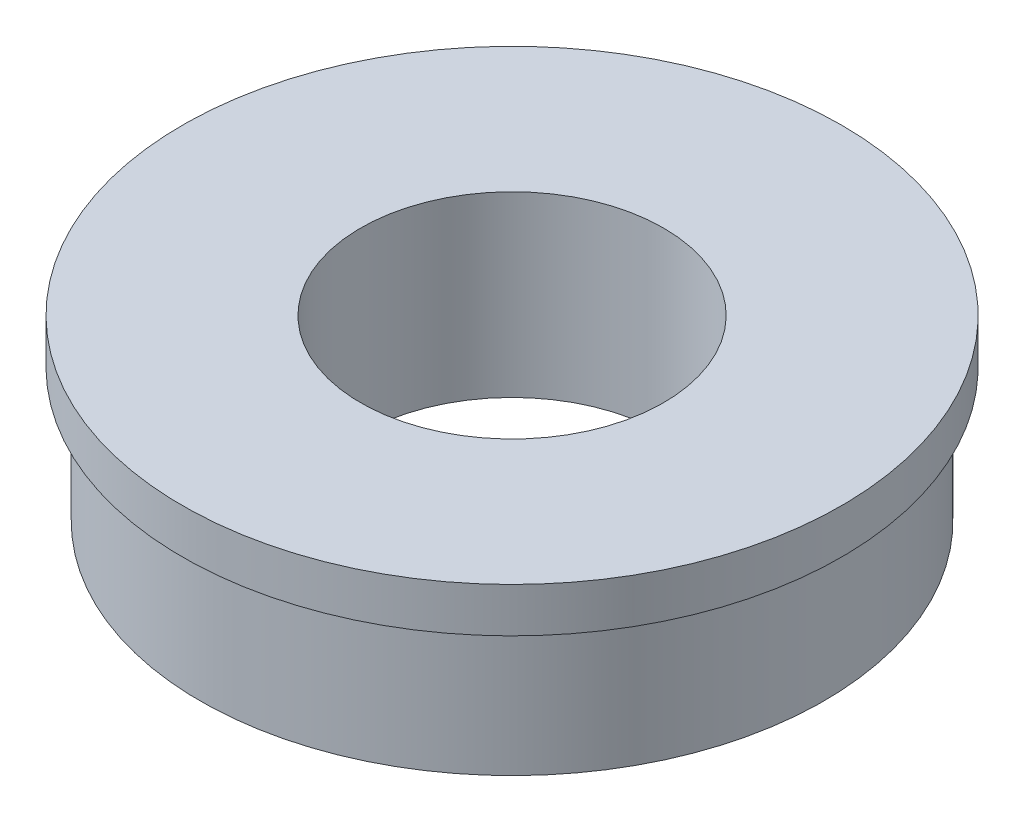
ISO-10303-21;
HEADER;
FILE_DESCRIPTION(('STEP AP214'),'2;1');
FILE_NAME('part.step','',(''),(''),'','','');
FILE_SCHEMA(('AUTOMOTIVE_DESIGN { 1 0 10303 214 1 1 1 1 }'));
ENDSEC;
DATA;
#1=APPLICATION_CONTEXT('core data for automotive mechanical design processes');
#2=APPLICATION_PROTOCOL_DEFINITION('international standard','automotive_design',2000,#1);
#3=PRODUCT_CONTEXT('',#1,'mechanical');
#4=PRODUCT('Part','Part','',(#3));
#5=PRODUCT_RELATED_PRODUCT_CATEGORY('part','',(#4));
#6=PRODUCT_DEFINITION_FORMATION('','',#4);
#7=PRODUCT_DEFINITION_CONTEXT('part definition',#1,'design');
#8=PRODUCT_DEFINITION('design','',#6,#7);
#9=PRODUCT_DEFINITION_SHAPE('','',#8);
#10=(LENGTH_UNIT() NAMED_UNIT(*) SI_UNIT(.MILLI.,.METRE.));
#11=(NAMED_UNIT(*) PLANE_ANGLE_UNIT() SI_UNIT($,.RADIAN.));
#12=(NAMED_UNIT(*) SI_UNIT($,.STERADIAN.) SOLID_ANGLE_UNIT());
#13=UNCERTAINTY_MEASURE_WITH_UNIT(LENGTH_MEASURE(1.E-05),#10,'distance_accuracy_value','');
#14=(GEOMETRIC_REPRESENTATION_CONTEXT(3) GLOBAL_UNCERTAINTY_ASSIGNED_CONTEXT((#13)) GLOBAL_UNIT_ASSIGNED_CONTEXT((#10,
#11,#12)) REPRESENTATION_CONTEXT('',''));
#15=CARTESIAN_POINT('',(0.,0.,0.));
#16=DIRECTION('',(0.,0.,1.));
#17=DIRECTION('',(1.,0.,0.));
#18=AXIS2_PLACEMENT_3D('',#15,#16,#17);
#19=CARTESIAN_POINT('',(0.,-7.37837869532181,0.));
#20=DIRECTION('',(0.,-1.,0.));
#21=DIRECTION('',(0.,0.,-1.));
#22=AXIS2_PLACEMENT_3D('',#19,#20,#21);
#23=CYLINDRICAL_SURFACE('',#22,8.5);
#24=CARTESIAN_POINT('',(0.,-10.,0.));
#25=DIRECTION('',(0.,-1.,0.));
#26=DIRECTION('',(0.,0.,-1.));
#27=AXIS2_PLACEMENT_3D('',#24,#25,#26);
#28=CIRCLE('',#27,8.5);
#29=CARTESIAN_POINT('',(0.,-10.,-8.5));
#30=VERTEX_POINT('',#29);
#31=EDGE_CURVE('E57',#30,#30,#28,.T.);
#32=ORIENTED_EDGE('',*,*,#31,.T.);
#33=EDGE_LOOP('',(#32));
#34=FACE_BOUND('',#33,.T.);
#35=CARTESIAN_POINT('',(0.,0.,0.));
#36=DIRECTION('',(0.,-1.,0.));
#37=DIRECTION('',(0.,0.,-1.));
#38=AXIS2_PLACEMENT_3D('',#35,#36,#37);
#39=CIRCLE('',#38,8.5);
#40=CARTESIAN_POINT('',(0.,0.,-8.5));
#41=VERTEX_POINT('',#40);
#42=EDGE_CURVE('E10',#41,#41,#39,.T.);
#43=ORIENTED_EDGE('',*,*,#42,.F.);
#44=EDGE_LOOP('',(#43));
#45=FACE_BOUND('',#44,.T.);
#46=ADVANCED_FACE('F35',(#34,#45),#23,.F.);
#47=CARTESIAN_POINT('',(8.5,0.,0.));
#48=DIRECTION('',(0.,1.,0.));
#49=DIRECTION('',(0.,0.,1.));
#50=AXIS2_PLACEMENT_3D('',#47,#48,#49);
#51=PLANE('',#50);
#52=ORIENTED_EDGE('',*,*,#42,.T.);
#53=EDGE_LOOP('',(#52));
#54=FACE_BOUND('',#53,.T.);
#55=CARTESIAN_POINT('',(0.,0.,0.));
#56=DIRECTION('',(0.,-1.,0.));
#57=DIRECTION('',(0.,0.,-1.));
#58=AXIS2_PLACEMENT_3D('',#55,#56,#57);
#59=CIRCLE('',#58,18.5);
#60=CARTESIAN_POINT('',(0.,0.,-18.5));
#61=VERTEX_POINT('',#60);
#62=EDGE_CURVE('E41',#61,#61,#59,.T.);
#63=ORIENTED_EDGE('',*,*,#62,.F.);
#64=EDGE_LOOP('',(#63));
#65=FACE_BOUND('',#64,.T.);
#66=ADVANCED_FACE('F75',(#54,#65),#51,.T.);
#67=CARTESIAN_POINT('',(0.,-7.37837869532181,0.));
#68=DIRECTION('',(0.,-1.,0.));
#69=DIRECTION('',(0.,0.,-1.));
#70=AXIS2_PLACEMENT_3D('',#67,#68,#69);
#71=CYLINDRICAL_SURFACE('',#70,18.5);
#72=ORIENTED_EDGE('',*,*,#62,.T.);
#73=EDGE_LOOP('',(#72));
#74=FACE_BOUND('',#73,.T.);
#75=CARTESIAN_POINT('',(0.,-2.5,0.));
#76=DIRECTION('',(0.,-1.,0.));
#77=DIRECTION('',(0.,0.,-1.));
#78=AXIS2_PLACEMENT_3D('',#75,#76,#77);
#79=CIRCLE('',#78,18.5);
#80=CARTESIAN_POINT('',(0.,-2.5,-18.5));
#81=VERTEX_POINT('',#80);
#82=EDGE_CURVE('E45',#81,#81,#79,.T.);
#83=ORIENTED_EDGE('',*,*,#82,.F.);
#84=EDGE_LOOP('',(#83));
#85=FACE_BOUND('',#84,.T.);
#86=ADVANCED_FACE('F79',(#74,#85),#71,.T.);
#87=CARTESIAN_POINT('',(18.5,-2.5,0.));
#88=DIRECTION('',(0.,-1.,0.));
#89=DIRECTION('',(0.,0.,-1.));
#90=AXIS2_PLACEMENT_3D('',#87,#88,#89);
#91=PLANE('',#90);
#92=ORIENTED_EDGE('',*,*,#82,.T.);
#93=EDGE_LOOP('',(#92));
#94=FACE_BOUND('',#93,.T.);
#95=CARTESIAN_POINT('',(0.,-2.5,0.));
#96=DIRECTION('',(0.,-1.,0.));
#97=DIRECTION('',(0.,0.,-1.));
#98=AXIS2_PLACEMENT_3D('',#95,#96,#97);
#99=CIRCLE('',#98,17.5);
#100=CARTESIAN_POINT('',(0.,-2.5,-17.5));
#101=VERTEX_POINT('',#100);
#102=EDGE_CURVE('E49',#101,#101,#99,.T.);
#103=ORIENTED_EDGE('',*,*,#102,.F.);
#104=EDGE_LOOP('',(#103));
#105=FACE_BOUND('',#104,.T.);
#106=ADVANCED_FACE('F71',(#94,#105),#91,.T.);
#107=CARTESIAN_POINT('',(0.,-7.37837869532181,0.));
#108=DIRECTION('',(0.,-1.,0.));
#109=DIRECTION('',(0.,0.,-1.));
#110=AXIS2_PLACEMENT_3D('',#107,#108,#109);
#111=CYLINDRICAL_SURFACE('',#110,17.5);
#112=ORIENTED_EDGE('',*,*,#102,.T.);
#113=EDGE_LOOP('',(#112));
#114=FACE_BOUND('',#113,.T.);
#115=CARTESIAN_POINT('',(0.,-10.,0.));
#116=DIRECTION('',(0.,-1.,0.));
#117=DIRECTION('',(0.,0.,-1.));
#118=AXIS2_PLACEMENT_3D('',#115,#116,#117);
#119=CIRCLE('',#118,17.5);
#120=CARTESIAN_POINT('',(0.,-10.,-17.5));
#121=VERTEX_POINT('',#120);
#122=EDGE_CURVE('E54',#121,#121,#119,.T.);
#123=ORIENTED_EDGE('',*,*,#122,.F.);
#124=EDGE_LOOP('',(#123));
#125=FACE_BOUND('',#124,.T.);
#126=ADVANCED_FACE('F65',(#114,#125),#111,.T.);
#127=CARTESIAN_POINT('',(17.5,-10.,0.));
#128=DIRECTION('',(0.,-1.,0.));
#129=DIRECTION('',(0.,0.,-1.));
#130=AXIS2_PLACEMENT_3D('',#127,#128,#129);
#131=PLANE('',#130);
#132=ORIENTED_EDGE('',*,*,#122,.T.);
#133=EDGE_LOOP('',(#132));
#134=FACE_BOUND('',#133,.T.);
#135=ORIENTED_EDGE('',*,*,#31,.F.);
#136=EDGE_LOOP('',(#135));
#137=FACE_BOUND('',#136,.T.);
#138=ADVANCED_FACE('F63',(#134,#137),#131,.T.);
#139=CLOSED_SHELL('',(#46,#66,#86,#106,#126,#138));
#140=MANIFOLD_SOLID_BREP('B2',#139);
#141=ADVANCED_BREP_SHAPE_REPRESENTATION('',(#18,#140),#14);
#142=SHAPE_DEFINITION_REPRESENTATION(#9,#141);
ENDSEC;
END-ISO-10303-21;
